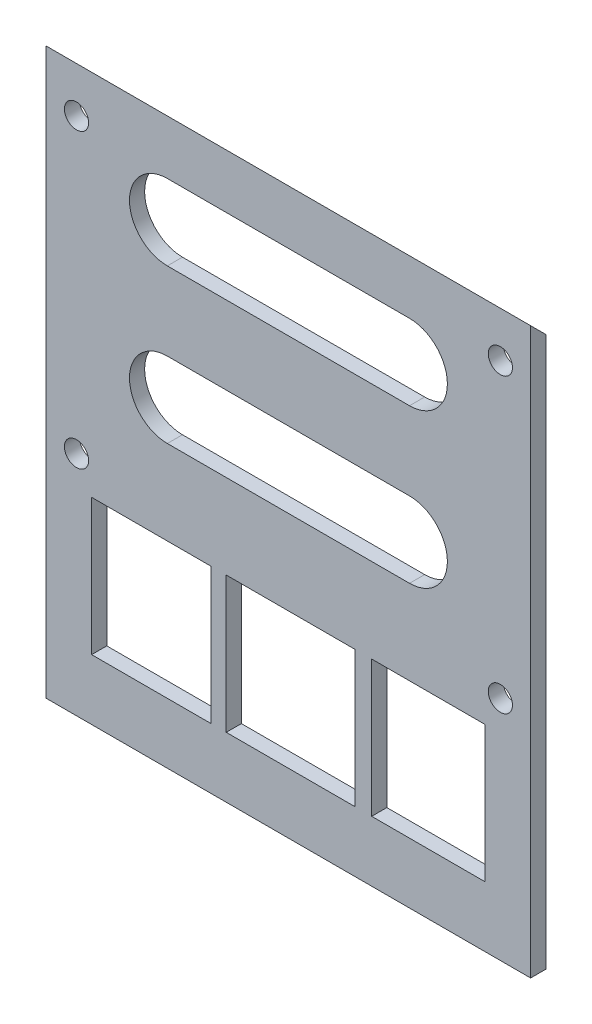
ISO-10303-21;
HEADER;
FILE_DESCRIPTION(('STEP AP214'),'2;1');
FILE_NAME('part.step','',(''),(''),'','','');
FILE_SCHEMA(('AUTOMOTIVE_DESIGN { 1 0 10303 214 1 1 1 1 }'));
ENDSEC;
DATA;
#1=APPLICATION_CONTEXT('core data for automotive mechanical design processes');
#2=APPLICATION_PROTOCOL_DEFINITION('international standard','automotive_design',2000,#1);
#3=PRODUCT_CONTEXT('',#1,'mechanical');
#4=PRODUCT('Part','Part','',(#3));
#5=PRODUCT_RELATED_PRODUCT_CATEGORY('part','',(#4));
#6=PRODUCT_DEFINITION_FORMATION('','',#4);
#7=PRODUCT_DEFINITION_CONTEXT('part definition',#1,'design');
#8=PRODUCT_DEFINITION('design','',#6,#7);
#9=PRODUCT_DEFINITION_SHAPE('','',#8);
#10=(LENGTH_UNIT() NAMED_UNIT(*) SI_UNIT(.MILLI.,.METRE.));
#11=(NAMED_UNIT(*) PLANE_ANGLE_UNIT() SI_UNIT($,.RADIAN.));
#12=(NAMED_UNIT(*) SI_UNIT($,.STERADIAN.) SOLID_ANGLE_UNIT());
#13=UNCERTAINTY_MEASURE_WITH_UNIT(LENGTH_MEASURE(1.E-05),#10,'distance_accuracy_value','');
#14=(GEOMETRIC_REPRESENTATION_CONTEXT(3) GLOBAL_UNCERTAINTY_ASSIGNED_CONTEXT((#13)) GLOBAL_UNIT_ASSIGNED_CONTEXT((#10,
#11,#12)) REPRESENTATION_CONTEXT('',''));
#15=CARTESIAN_POINT('',(0.,0.,0.));
#16=DIRECTION('',(0.,0.,1.));
#17=DIRECTION('',(1.,0.,0.));
#18=AXIS2_PLACEMENT_3D('',#15,#16,#17);
#19=CARTESIAN_POINT('',(0.,26.,2.));
#20=DIRECTION('',(0.,1.,0.));
#21=DIRECTION('',(0.,0.,1.));
#22=AXIS2_PLACEMENT_3D('',#19,#20,#21);
#23=PLANE('',#22);
#24=DIRECTION('',(0.,0.,1.));
#25=VECTOR('',#24,1.);
#26=CARTESIAN_POINT('',(23.7834334285164,26.,0.));
#27=LINE('',#26,#25);
#28=CARTESIAN_POINT('',(23.7834334285164,26.,0.));
#29=VERTEX_POINT('',#28);
#30=CARTESIAN_POINT('',(23.7834334285164,26.,2.));
#31=VERTEX_POINT('',#30);
#32=EDGE_CURVE('E311',#29,#31,#27,.T.);
#33=ORIENTED_EDGE('',*,*,#32,.F.);
#34=DIRECTION('',(1.,0.,0.));
#35=VECTOR('',#34,1.);
#36=CARTESIAN_POINT('',(0.,26.,0.));
#37=LINE('',#36,#35);
#38=CARTESIAN_POINT('',(40.7834334285164,26.,0.));
#39=VERTEX_POINT('',#38);
#40=EDGE_CURVE('E451',#29,#39,#37,.T.);
#41=ORIENTED_EDGE('',*,*,#40,.T.);
#42=DIRECTION('',(0.,0.,1.));
#43=VECTOR('',#42,1.);
#44=CARTESIAN_POINT('',(40.7834334285164,26.,0.));
#45=LINE('',#44,#43);
#46=CARTESIAN_POINT('',(40.7834334285164,26.,2.));
#47=VERTEX_POINT('',#46);
#48=EDGE_CURVE('E343',#39,#47,#45,.T.);
#49=ORIENTED_EDGE('',*,*,#48,.T.);
#50=DIRECTION('',(1.,0.,0.));
#51=VECTOR('',#50,1.);
#52=CARTESIAN_POINT('',(0.,26.,2.));
#53=LINE('',#52,#51);
#54=EDGE_CURVE('E420',#31,#47,#53,.T.);
#55=ORIENTED_EDGE('',*,*,#54,.F.);
#56=EDGE_LOOP('',(#33,#41,#49,#55));
#57=FACE_BOUND('',#56,.T.);
#58=ADVANCED_FACE('F49',(#57),#23,.F.);
#59=CARTESIAN_POINT('',(0.,8.00000000000002,2.));
#60=DIRECTION('',(0.,1.,0.));
#61=DIRECTION('',(0.,0.,1.));
#62=AXIS2_PLACEMENT_3D('',#59,#60,#61);
#63=PLANE('',#62);
#64=DIRECTION('',(1.,0.,0.));
#65=VECTOR('',#64,1.);
#66=CARTESIAN_POINT('',(0.,8.00000000000002,0.));
#67=LINE('',#66,#65);
#68=CARTESIAN_POINT('',(23.7834334285164,8.00000000000002,0.));
#69=VERTEX_POINT('',#68);
#70=CARTESIAN_POINT('',(40.7834334285164,8.00000000000002,0.));
#71=VERTEX_POINT('',#70);
#72=EDGE_CURVE('E460',#69,#71,#67,.T.);
#73=ORIENTED_EDGE('',*,*,#72,.F.);
#74=DIRECTION('',(0.,0.,1.));
#75=VECTOR('',#74,1.);
#76=CARTESIAN_POINT('',(23.7834334285164,8.00000000000002,0.));
#77=LINE('',#76,#75);
#78=CARTESIAN_POINT('',(23.7834334285164,8.00000000000002,2.));
#79=VERTEX_POINT('',#78);
#80=EDGE_CURVE('E306',#69,#79,#77,.T.);
#81=ORIENTED_EDGE('',*,*,#80,.T.);
#82=DIRECTION('',(1.,0.,0.));
#83=VECTOR('',#82,1.);
#84=CARTESIAN_POINT('',(0.,8.00000000000002,2.));
#85=LINE('',#84,#83);
#86=CARTESIAN_POINT('',(40.7834334285164,8.00000000000002,2.));
#87=VERTEX_POINT('',#86);
#88=EDGE_CURVE('E430',#79,#87,#85,.T.);
#89=ORIENTED_EDGE('',*,*,#88,.T.);
#90=DIRECTION('',(0.,0.,1.));
#91=VECTOR('',#90,1.);
#92=CARTESIAN_POINT('',(40.7834334285164,8.00000000000002,0.));
#93=LINE('',#92,#91);
#94=EDGE_CURVE('E358',#71,#87,#93,.T.);
#95=ORIENTED_EDGE('',*,*,#94,.F.);
#96=EDGE_LOOP('',(#73,#81,#89,#95));
#97=FACE_BOUND('',#96,.T.);
#98=ADVANCED_FACE('F519',(#97),#63,.T.);
#99=DIRECTION('',(0.,0.,1.));
#100=VECTOR('',#99,1.);
#101=CARTESIAN_POINT('',(43.,26.,0.));
#102=LINE('',#101,#100);
#103=CARTESIAN_POINT('',(43.,26.,0.));
#104=VERTEX_POINT('',#103);
#105=CARTESIAN_POINT('',(43.,26.,2.));
#106=VERTEX_POINT('',#105);
#107=EDGE_CURVE('E349',#104,#106,#102,.T.);
#108=ORIENTED_EDGE('',*,*,#107,.F.);
#109=CARTESIAN_POINT('',(58.0000000000001,26.,0.));
#110=VERTEX_POINT('',#109);
#111=EDGE_CURVE('E446',#104,#110,#37,.T.);
#112=ORIENTED_EDGE('',*,*,#111,.T.);
#113=DIRECTION('',(0.,0.,-1.));
#114=VECTOR('',#113,1.);
#115=CARTESIAN_POINT('',(58.0000000000001,26.,2.));
#116=LINE('',#115,#114);
#117=CARTESIAN_POINT('',(58.0000000000001,26.,2.));
#118=VERTEX_POINT('',#117);
#119=EDGE_CURVE('E475',#118,#110,#116,.T.);
#120=ORIENTED_EDGE('',*,*,#119,.F.);
#121=EDGE_CURVE('E414',#106,#118,#53,.T.);
#122=ORIENTED_EDGE('',*,*,#121,.F.);
#123=EDGE_LOOP('',(#108,#112,#120,#122));
#124=FACE_BOUND('',#123,.T.);
#125=ADVANCED_FACE('F524',(#124),#23,.F.);
#126=CARTESIAN_POINT('',(43.,8.00000000000002,0.));
#127=VERTEX_POINT('',#126);
#128=CARTESIAN_POINT('',(58.0000000000001,8.00000000000002,0.));
#129=VERTEX_POINT('',#128);
#130=EDGE_CURVE('E455',#127,#129,#67,.T.);
#131=ORIENTED_EDGE('',*,*,#130,.F.);
#132=DIRECTION('',(0.,0.,1.));
#133=VECTOR('',#132,1.);
#134=CARTESIAN_POINT('',(43.,8.00000000000002,0.));
#135=LINE('',#134,#133);
#136=CARTESIAN_POINT('',(43.,8.00000000000002,2.));
#137=VERTEX_POINT('',#136);
#138=EDGE_CURVE('E354',#127,#137,#135,.T.);
#139=ORIENTED_EDGE('',*,*,#138,.T.);
#140=CARTESIAN_POINT('',(58.0000000000001,8.00000000000002,2.));
#141=VERTEX_POINT('',#140);
#142=EDGE_CURVE('E424',#137,#141,#85,.T.);
#143=ORIENTED_EDGE('',*,*,#142,.T.);
#144=DIRECTION('',(0.,0.,-1.));
#145=VECTOR('',#144,1.);
#146=CARTESIAN_POINT('',(58.0000000000001,8.00000000000002,2.));
#147=LINE('',#146,#145);
#148=EDGE_CURVE('E471',#141,#129,#147,.T.);
#149=ORIENTED_EDGE('',*,*,#148,.T.);
#150=EDGE_LOOP('',(#131,#139,#143,#149));
#151=FACE_BOUND('',#150,.T.);
#152=ADVANCED_FACE('F520',(#151),#63,.T.);
#153=CARTESIAN_POINT('',(6.,26.,0.));
#154=VERTEX_POINT('',#153);
#155=CARTESIAN_POINT('',(21.7834334285164,26.,0.));
#156=VERTEX_POINT('',#155);
#157=EDGE_CURVE('E447',#154,#156,#37,.T.);
#158=ORIENTED_EDGE('',*,*,#157,.T.);
#159=DIRECTION('',(0.,0.,1.));
#160=VECTOR('',#159,1.);
#161=CARTESIAN_POINT('',(21.7834334285164,26.,0.));
#162=LINE('',#161,#160);
#163=CARTESIAN_POINT('',(21.7834334285164,26.,2.));
#164=VERTEX_POINT('',#163);
#165=EDGE_CURVE('E315',#156,#164,#162,.T.);
#166=ORIENTED_EDGE('',*,*,#165,.T.);
#167=CARTESIAN_POINT('',(6.,26.,2.));
#168=VERTEX_POINT('',#167);
#169=EDGE_CURVE('E415',#168,#164,#53,.T.);
#170=ORIENTED_EDGE('',*,*,#169,.F.);
#171=DIRECTION('',(0.,0.,-1.));
#172=VECTOR('',#171,1.);
#173=CARTESIAN_POINT('',(6.,26.,2.));
#174=LINE('',#173,#172);
#175=EDGE_CURVE('E464',#168,#154,#174,.T.);
#176=ORIENTED_EDGE('',*,*,#175,.T.);
#177=EDGE_LOOP('',(#158,#166,#170,#176));
#178=FACE_BOUND('',#177,.T.);
#179=ADVANCED_FACE('F525',(#178),#23,.F.);
#180=CARTESIAN_POINT('',(58.0000000000001,0.,2.));
#181=DIRECTION('',(1.,0.,0.));
#182=DIRECTION('',(0.,0.,-1.));
#183=AXIS2_PLACEMENT_3D('',#180,#181,#182);
#184=PLANE('',#183);
#185=DIRECTION('',(0.,-1.,0.));
#186=VECTOR('',#185,1.);
#187=CARTESIAN_POINT('',(58.0000000000001,0.,0.));
#188=LINE('',#187,#186);
#189=EDGE_CURVE('E450',#110,#129,#188,.T.);
#190=ORIENTED_EDGE('',*,*,#189,.T.);
#191=ORIENTED_EDGE('',*,*,#148,.F.);
#192=DIRECTION('',(0.,-1.,0.));
#193=VECTOR('',#192,1.);
#194=CARTESIAN_POINT('',(58.0000000000001,0.,2.));
#195=LINE('',#194,#193);
#196=EDGE_CURVE('E419',#118,#141,#195,.T.);
#197=ORIENTED_EDGE('',*,*,#196,.F.);
#198=ORIENTED_EDGE('',*,*,#119,.T.);
#199=EDGE_LOOP('',(#190,#191,#197,#198));
#200=FACE_BOUND('',#199,.T.);
#201=ADVANCED_FACE('F516',(#200),#184,.F.);
#202=DIRECTION('',(0.,0.,1.));
#203=VECTOR('',#202,1.);
#204=CARTESIAN_POINT('',(21.7834334285164,8.00000000000002,0.));
#205=LINE('',#204,#203);
#206=CARTESIAN_POINT('',(21.7834334285164,8.00000000000002,0.));
#207=VERTEX_POINT('',#206);
#208=CARTESIAN_POINT('',(21.7834334285164,8.00000000000002,2.));
#209=VERTEX_POINT('',#208);
#210=EDGE_CURVE('E259',#207,#209,#205,.T.);
#211=ORIENTED_EDGE('',*,*,#210,.F.);
#212=CARTESIAN_POINT('',(6.,8.00000000000002,0.));
#213=VERTEX_POINT('',#212);
#214=EDGE_CURVE('E456',#213,#207,#67,.T.);
#215=ORIENTED_EDGE('',*,*,#214,.F.);
#216=DIRECTION('',(0.,0.,-1.));
#217=VECTOR('',#216,1.);
#218=CARTESIAN_POINT('',(6.,8.00000000000002,2.));
#219=LINE('',#218,#217);
#220=CARTESIAN_POINT('',(6.,8.00000000000002,2.));
#221=VERTEX_POINT('',#220);
#222=EDGE_CURVE('E467',#221,#213,#219,.T.);
#223=ORIENTED_EDGE('',*,*,#222,.F.);
#224=EDGE_CURVE('E425',#221,#209,#85,.T.);
#225=ORIENTED_EDGE('',*,*,#224,.T.);
#226=EDGE_LOOP('',(#211,#215,#223,#225));
#227=FACE_BOUND('',#226,.T.);
#228=ADVANCED_FACE('F508',(#227),#63,.T.);
#229=CARTESIAN_POINT('',(0.,0.,2.));
#230=DIRECTION('',(0.,1.,0.));
#231=DIRECTION('',(0.,0.,1.));
#232=AXIS2_PLACEMENT_3D('',#229,#230,#231);
#233=PLANE('',#232);
#234=DIRECTION('',(1.,0.,0.));
#235=VECTOR('',#234,1.);
#236=CARTESIAN_POINT('',(0.,0.,0.));
#237=LINE('',#236,#235);
#238=CARTESIAN_POINT('',(0.,0.,0.));
#239=VERTEX_POINT('',#238);
#240=CARTESIAN_POINT('',(64.,0.,0.));
#241=VERTEX_POINT('',#240);
#242=EDGE_CURVE('E393',#239,#241,#237,.T.);
#243=ORIENTED_EDGE('',*,*,#242,.T.);
#244=DIRECTION('',(0.,0.,-1.));
#245=VECTOR('',#244,1.);
#246=CARTESIAN_POINT('',(64.,0.,2.));
#247=LINE('',#246,#245);
#248=CARTESIAN_POINT('',(64.,0.,2.));
#249=VERTEX_POINT('',#248);
#250=EDGE_CURVE('E468',#249,#241,#247,.T.);
#251=ORIENTED_EDGE('',*,*,#250,.F.);
#252=DIRECTION('',(1.,0.,0.));
#253=VECTOR('',#252,1.);
#254=CARTESIAN_POINT('',(0.,0.,2.));
#255=LINE('',#254,#253);
#256=CARTESIAN_POINT('',(0.,0.,2.));
#257=VERTEX_POINT('',#256);
#258=EDGE_CURVE('E397',#257,#249,#255,.T.);
#259=ORIENTED_EDGE('',*,*,#258,.F.);
#260=DIRECTION('',(0.,0.,-1.));
#261=VECTOR('',#260,1.);
#262=CARTESIAN_POINT('',(0.,0.,2.));
#263=LINE('',#262,#261);
#264=EDGE_CURVE('E434',#257,#239,#263,.T.);
#265=ORIENTED_EDGE('',*,*,#264,.T.);
#266=EDGE_LOOP('',(#243,#251,#259,#265));
#267=FACE_BOUND('',#266,.T.);
#268=ADVANCED_FACE('F506',(#267),#233,.F.);
#269=CARTESIAN_POINT('',(64.,0.,2.));
#270=DIRECTION('',(-1.,0.,0.));
#271=DIRECTION('',(0.,0.,1.));
#272=AXIS2_PLACEMENT_3D('',#269,#270,#271);
#273=PLANE('',#272);
#274=DIRECTION('',(0.,1.,0.));
#275=VECTOR('',#274,1.);
#276=CARTESIAN_POINT('',(64.,0.,0.));
#277=LINE('',#276,#275);
#278=CARTESIAN_POINT('',(64.,72.64,0.));
#279=VERTEX_POINT('',#278);
#280=EDGE_CURVE('E438',#241,#279,#277,.T.);
#281=ORIENTED_EDGE('',*,*,#280,.T.);
#282=DIRECTION('',(0.,-0.70710678118655,-0.707106781186545));
#283=VECTOR('',#282,1.);
#284=CARTESIAN_POINT('',(64.,74.64,1.99999999999999));
#285=LINE('',#284,#283);
#286=CARTESIAN_POINT('',(64.,74.64,2.));
#287=VERTEX_POINT('',#286);
#288=EDGE_CURVE('E11',#279,#287,#285,.F.);
#289=ORIENTED_EDGE('',*,*,#288,.T.);
#290=DIRECTION('',(0.,1.,0.));
#291=VECTOR('',#290,1.);
#292=CARTESIAN_POINT('',(64.,0.,2.));
#293=LINE('',#292,#291);
#294=EDGE_CURVE('E401',#249,#287,#293,.T.);
#295=ORIENTED_EDGE('',*,*,#294,.F.);
#296=ORIENTED_EDGE('',*,*,#250,.T.);
#297=EDGE_LOOP('',(#281,#289,#295,#296));
#298=FACE_BOUND('',#297,.T.);
#299=ADVANCED_FACE('F496',(#298),#273,.F.);
#300=CARTESIAN_POINT('',(0.,0.,2.));
#301=DIRECTION('',(-1.,0.,0.));
#302=DIRECTION('',(0.,-1.,0.));
#303=AXIS2_PLACEMENT_3D('',#300,#301,#302);
#304=PLANE('',#303);
#305=DIRECTION('',(0.,1.,0.));
#306=VECTOR('',#305,1.);
#307=CARTESIAN_POINT('',(0.,0.,2.));
#308=LINE('',#307,#306);
#309=CARTESIAN_POINT('',(0.,74.64,2.));
#310=VERTEX_POINT('',#309);
#311=EDGE_CURVE('E410',#257,#310,#308,.T.);
#312=ORIENTED_EDGE('',*,*,#311,.T.);
#313=DIRECTION('',(0.,0.70710678118655,0.707106781186545));
#314=VECTOR('',#313,1.);
#315=CARTESIAN_POINT('',(0.,37.3199999999997,-35.32));
#316=LINE('',#315,#314);
#317=CARTESIAN_POINT('',(0.,72.64,0.));
#318=VERTEX_POINT('',#317);
#319=EDGE_CURVE('E479',#310,#318,#316,.F.);
#320=ORIENTED_EDGE('',*,*,#319,.T.);
#321=DIRECTION('',(0.,1.,0.));
#322=VECTOR('',#321,1.);
#323=CARTESIAN_POINT('',(0.,0.,0.));
#324=LINE('',#323,#322);
#325=EDGE_CURVE('E442',#239,#318,#324,.T.);
#326=ORIENTED_EDGE('',*,*,#325,.F.);
#327=ORIENTED_EDGE('',*,*,#264,.F.);
#328=EDGE_LOOP('',(#312,#320,#326,#327));
#329=FACE_BOUND('',#328,.T.);
#330=ADVANCED_FACE('F503',(#329),#304,.T.);
#331=CARTESIAN_POINT('',(6.,0.,2.));
#332=DIRECTION('',(1.,0.,0.));
#333=DIRECTION('',(0.,1.,0.));
#334=AXIS2_PLACEMENT_3D('',#331,#332,#333);
#335=PLANE('',#334);
#336=DIRECTION('',(0.,-1.,0.));
#337=VECTOR('',#336,1.);
#338=CARTESIAN_POINT('',(6.,0.,0.));
#339=LINE('',#338,#337);
#340=EDGE_CURVE('E402',#154,#213,#339,.T.);
#341=ORIENTED_EDGE('',*,*,#340,.F.);
#342=ORIENTED_EDGE('',*,*,#175,.F.);
#343=DIRECTION('',(0.,-1.,0.));
#344=VECTOR('',#343,1.);
#345=CARTESIAN_POINT('',(6.,0.,2.));
#346=LINE('',#345,#344);
#347=EDGE_CURVE('E429',#168,#221,#346,.T.);
#348=ORIENTED_EDGE('',*,*,#347,.T.);
#349=ORIENTED_EDGE('',*,*,#222,.T.);
#350=EDGE_LOOP('',(#341,#342,#348,#349));
#351=FACE_BOUND('',#350,.T.);
#352=ADVANCED_FACE('F556',(#351),#335,.T.);
#353=CARTESIAN_POINT('',(0.,0.,2.));
#354=DIRECTION('',(0.,0.,1.));
#355=DIRECTION('',(1.,0.,0.));
#356=AXIS2_PLACEMENT_3D('',#353,#354,#355);
#357=PLANE('',#356);
#358=CARTESIAN_POINT('',(48.,42.1600000000005,2.));
#359=DIRECTION('',(0.,0.,-1.));
#360=DIRECTION('',(-1.,0.,0.));
#361=AXIS2_PLACEMENT_3D('',#358,#359,#360);
#362=CIRCLE('',#361,5.);
#363=CARTESIAN_POINT('',(48.,47.16,2.));
#364=VERTEX_POINT('',#363);
#365=CARTESIAN_POINT('',(48.,37.16,2.));
#366=VERTEX_POINT('',#365);
#367=EDGE_CURVE('E215',#364,#366,#362,.T.);
#368=ORIENTED_EDGE('',*,*,#367,.T.);
#369=DIRECTION('',(-1.,0.,0.));
#370=VECTOR('',#369,1.);
#371=CARTESIAN_POINT('',(48.,37.16,2.));
#372=LINE('',#371,#370);
#373=CARTESIAN_POINT('',(16.,37.16,2.));
#374=VERTEX_POINT('',#373);
#375=EDGE_CURVE('E227',#366,#374,#372,.T.);
#376=ORIENTED_EDGE('',*,*,#375,.T.);
#377=CARTESIAN_POINT('',(16.,42.16,2.));
#378=DIRECTION('',(0.,0.,-1.));
#379=DIRECTION('',(-1.,0.,0.));
#380=AXIS2_PLACEMENT_3D('',#377,#378,#379);
#381=CIRCLE('',#380,5.);
#382=CARTESIAN_POINT('',(16.,47.16,2.));
#383=VERTEX_POINT('',#382);
#384=EDGE_CURVE('E66',#374,#383,#381,.T.);
#385=ORIENTED_EDGE('',*,*,#384,.T.);
#386=DIRECTION('',(1.,0.,0.));
#387=VECTOR('',#386,1.);
#388=CARTESIAN_POINT('',(48.,47.16,2.));
#389=LINE('',#388,#387);
#390=EDGE_CURVE('E224',#383,#364,#389,.T.);
#391=ORIENTED_EDGE('',*,*,#390,.T.);
#392=EDGE_LOOP('',(#368,#376,#385,#391));
#393=FACE_BOUND('',#392,.T.);
#394=CARTESIAN_POINT('',(48.,62.48,2.));
#395=DIRECTION('',(0.,0.,-1.));
#396=DIRECTION('',(-1.,0.,0.));
#397=AXIS2_PLACEMENT_3D('',#394,#395,#396);
#398=CIRCLE('',#397,5.);
#399=CARTESIAN_POINT('',(48.,67.48,2.));
#400=VERTEX_POINT('',#399);
#401=CARTESIAN_POINT('',(48.,57.48,2.));
#402=VERTEX_POINT('',#401);
#403=EDGE_CURVE('E284',#400,#402,#398,.T.);
#404=ORIENTED_EDGE('',*,*,#403,.T.);
#405=DIRECTION('',(-1.,0.,0.));
#406=VECTOR('',#405,1.);
#407=CARTESIAN_POINT('',(48.,57.48,2.));
#408=LINE('',#407,#406);
#409=CARTESIAN_POINT('',(16.,57.48,2.));
#410=VERTEX_POINT('',#409);
#411=EDGE_CURVE('E299',#402,#410,#408,.T.);
#412=ORIENTED_EDGE('',*,*,#411,.T.);
#413=CARTESIAN_POINT('',(16.,62.48,2.));
#414=DIRECTION('',(0.,0.,-1.));
#415=DIRECTION('',(-1.,0.,0.));
#416=AXIS2_PLACEMENT_3D('',#413,#414,#415);
#417=CIRCLE('',#416,5.);
#418=CARTESIAN_POINT('',(16.,67.48,2.));
#419=VERTEX_POINT('',#418);
#420=EDGE_CURVE('E74',#410,#419,#417,.T.);
#421=ORIENTED_EDGE('',*,*,#420,.T.);
#422=DIRECTION('',(1.,0.,0.));
#423=VECTOR('',#422,1.);
#424=CARTESIAN_POINT('',(48.,67.48,2.));
#425=LINE('',#424,#423);
#426=EDGE_CURVE('E269',#419,#400,#425,.T.);
#427=ORIENTED_EDGE('',*,*,#426,.T.);
#428=EDGE_LOOP('',(#404,#412,#421,#427));
#429=FACE_BOUND('',#428,.T.);
#430=ORIENTED_EDGE('',*,*,#88,.F.);
#431=DIRECTION('',(0.,-1.,0.));
#432=VECTOR('',#431,1.);
#433=CARTESIAN_POINT('',(23.7834334285164,26.,2.));
#434=LINE('',#433,#432);
#435=EDGE_CURVE('E324',#31,#79,#434,.T.);
#436=ORIENTED_EDGE('',*,*,#435,.F.);
#437=ORIENTED_EDGE('',*,*,#54,.T.);
#438=DIRECTION('',(0.,-1.,0.));
#439=VECTOR('',#438,1.);
#440=CARTESIAN_POINT('',(40.7834334285164,0.,2.));
#441=LINE('',#440,#439);
#442=EDGE_CURVE('E328',#47,#87,#441,.T.);
#443=ORIENTED_EDGE('',*,*,#442,.T.);
#444=EDGE_LOOP('',(#430,#436,#437,#443));
#445=FACE_BOUND('',#444,.T.);
#446=DIRECTION('',(0.,-1.,0.));
#447=VECTOR('',#446,1.);
#448=CARTESIAN_POINT('',(43.,0.,2.));
#449=LINE('',#448,#447);
#450=EDGE_CURVE('E339',#106,#137,#449,.T.);
#451=ORIENTED_EDGE('',*,*,#450,.F.);
#452=ORIENTED_EDGE('',*,*,#121,.T.);
#453=ORIENTED_EDGE('',*,*,#196,.T.);
#454=ORIENTED_EDGE('',*,*,#142,.F.);
#455=EDGE_LOOP('',(#451,#452,#453,#454));
#456=FACE_BOUND('',#455,.T.);
#457=CARTESIAN_POINT('',(60.,30.,2.));
#458=DIRECTION('',(0.,0.,1.));
#459=DIRECTION('',(1.,0.,0.));
#460=AXIS2_PLACEMENT_3D('',#457,#458,#459);
#461=CIRCLE('',#460,1.6);
#462=CARTESIAN_POINT('',(61.6,30.,2.));
#463=VERTEX_POINT('',#462);
#464=EDGE_CURVE('E373',#463,#463,#461,.T.);
#465=ORIENTED_EDGE('',*,*,#464,.F.);
#466=EDGE_LOOP('',(#465));
#467=FACE_BOUND('',#466,.T.);
#468=CARTESIAN_POINT('',(4.,68.64,2.));
#469=DIRECTION('',(0.,0.,1.));
#470=DIRECTION('',(1.,0.,0.));
#471=AXIS2_PLACEMENT_3D('',#468,#469,#470);
#472=CIRCLE('',#471,1.6);
#473=CARTESIAN_POINT('',(5.6,68.64,2.));
#474=VERTEX_POINT('',#473);
#475=EDGE_CURVE('E382',#474,#474,#472,.T.);
#476=ORIENTED_EDGE('',*,*,#475,.F.);
#477=EDGE_LOOP('',(#476));
#478=FACE_BOUND('',#477,.T.);
#479=CARTESIAN_POINT('',(60.,68.64,2.));
#480=DIRECTION('',(0.,0.,1.));
#481=DIRECTION('',(1.,0.,0.));
#482=AXIS2_PLACEMENT_3D('',#479,#480,#481);
#483=CIRCLE('',#482,1.6);
#484=CARTESIAN_POINT('',(61.6,68.64,2.));
#485=VERTEX_POINT('',#484);
#486=EDGE_CURVE('E365',#485,#485,#483,.T.);
#487=ORIENTED_EDGE('',*,*,#486,.F.);
#488=EDGE_LOOP('',(#487));
#489=FACE_BOUND('',#488,.T.);
#490=CARTESIAN_POINT('',(4.,30.,2.));
#491=DIRECTION('',(0.,0.,1.));
#492=DIRECTION('',(1.,0.,0.));
#493=AXIS2_PLACEMENT_3D('',#490,#491,#492);
#494=CIRCLE('',#493,1.6);
#495=CARTESIAN_POINT('',(5.6,30.,2.));
#496=VERTEX_POINT('',#495);
#497=EDGE_CURVE('E377',#496,#496,#494,.T.);
#498=ORIENTED_EDGE('',*,*,#497,.F.);
#499=EDGE_LOOP('',(#498));
#500=FACE_BOUND('',#499,.T.);
#501=ORIENTED_EDGE('',*,*,#258,.T.);
#502=ORIENTED_EDGE('',*,*,#294,.T.);
#503=DIRECTION('',(-1.,0.,0.));
#504=VECTOR('',#503,1.);
#505=CARTESIAN_POINT('',(0.,74.64,2.));
#506=LINE('',#505,#504);
#507=EDGE_CURVE('E406',#287,#310,#506,.T.);
#508=ORIENTED_EDGE('',*,*,#507,.T.);
#509=ORIENTED_EDGE('',*,*,#311,.F.);
#510=EDGE_LOOP('',(#501,#502,#508,#509));
#511=FACE_BOUND('',#510,.T.);
#512=ORIENTED_EDGE('',*,*,#169,.T.);
#513=DIRECTION('',(0.,-1.,0.));
#514=VECTOR('',#513,1.);
#515=CARTESIAN_POINT('',(21.7834334285164,26.,2.));
#516=LINE('',#515,#514);
#517=EDGE_CURVE('E320',#164,#209,#516,.T.);
#518=ORIENTED_EDGE('',*,*,#517,.T.);
#519=ORIENTED_EDGE('',*,*,#224,.F.);
#520=ORIENTED_EDGE('',*,*,#347,.F.);
#521=EDGE_LOOP('',(#512,#518,#519,#520));
#522=FACE_BOUND('',#521,.T.);
#523=ADVANCED_FACE('F232',(#393,#429,#445,#456,#467,#478,#489,#500,#511,#522),#357,.T.);
#524=CARTESIAN_POINT('',(0.,0.,0.));
#525=DIRECTION('',(0.,0.,1.));
#526=DIRECTION('',(1.,0.,0.));
#527=AXIS2_PLACEMENT_3D('',#524,#525,#526);
#528=PLANE('',#527);
#529=DIRECTION('',(-1.,0.,0.));
#530=VECTOR('',#529,1.);
#531=CARTESIAN_POINT('',(48.,37.16,0.));
#532=LINE('',#531,#530);
#533=CARTESIAN_POINT('',(48.,37.16,0.));
#534=VERTEX_POINT('',#533);
#535=CARTESIAN_POINT('',(16.,37.16,0.));
#536=VERTEX_POINT('',#535);
#537=EDGE_CURVE('E249',#534,#536,#532,.T.);
#538=ORIENTED_EDGE('',*,*,#537,.F.);
#539=CARTESIAN_POINT('',(48.,42.1600000000005,0.));
#540=DIRECTION('',(0.,0.,-1.));
#541=DIRECTION('',(-1.,0.,0.));
#542=AXIS2_PLACEMENT_3D('',#539,#540,#541);
#543=CIRCLE('',#542,5.);
#544=CARTESIAN_POINT('',(48.,47.16,0.));
#545=VERTEX_POINT('',#544);
#546=EDGE_CURVE('E218',#545,#534,#543,.T.);
#547=ORIENTED_EDGE('',*,*,#546,.F.);
#548=DIRECTION('',(1.,0.,0.));
#549=VECTOR('',#548,1.);
#550=CARTESIAN_POINT('',(48.,47.16,0.));
#551=LINE('',#550,#549);
#552=CARTESIAN_POINT('',(16.,47.16,0.));
#553=VERTEX_POINT('',#552);
#554=EDGE_CURVE('E236',#553,#545,#551,.T.);
#555=ORIENTED_EDGE('',*,*,#554,.F.);
#556=CARTESIAN_POINT('',(16.,42.16,0.));
#557=DIRECTION('',(0.,0.,-1.));
#558=DIRECTION('',(-1.,0.,0.));
#559=AXIS2_PLACEMENT_3D('',#556,#557,#558);
#560=CIRCLE('',#559,5.);
#561=EDGE_CURVE('E240',#536,#553,#560,.T.);
#562=ORIENTED_EDGE('',*,*,#561,.F.);
#563=EDGE_LOOP('',(#538,#547,#555,#562));
#564=FACE_BOUND('',#563,.T.);
#565=DIRECTION('',(-1.,0.,0.));
#566=VECTOR('',#565,1.);
#567=CARTESIAN_POINT('',(48.,57.48,0.));
#568=LINE('',#567,#566);
#569=CARTESIAN_POINT('',(48.,57.48,0.));
#570=VERTEX_POINT('',#569);
#571=CARTESIAN_POINT('',(16.,57.48,0.));
#572=VERTEX_POINT('',#571);
#573=EDGE_CURVE('E288',#570,#572,#568,.T.);
#574=ORIENTED_EDGE('',*,*,#573,.F.);
#575=CARTESIAN_POINT('',(48.,62.48,0.));
#576=DIRECTION('',(0.,0.,-1.));
#577=DIRECTION('',(-1.,0.,0.));
#578=AXIS2_PLACEMENT_3D('',#575,#576,#577);
#579=CIRCLE('',#578,5.);
#580=CARTESIAN_POINT('',(48.,67.48,0.));
#581=VERTEX_POINT('',#580);
#582=EDGE_CURVE('E250',#581,#570,#579,.T.);
#583=ORIENTED_EDGE('',*,*,#582,.F.);
#584=DIRECTION('',(1.,0.,0.));
#585=VECTOR('',#584,1.);
#586=CARTESIAN_POINT('',(48.,67.48,0.));
#587=LINE('',#586,#585);
#588=CARTESIAN_POINT('',(16.,67.48,0.));
#589=VERTEX_POINT('',#588);
#590=EDGE_CURVE('E279',#589,#581,#587,.T.);
#591=ORIENTED_EDGE('',*,*,#590,.F.);
#592=CARTESIAN_POINT('',(16.,62.48,0.));
#593=DIRECTION('',(0.,0.,-1.));
#594=DIRECTION('',(-1.,0.,0.));
#595=AXIS2_PLACEMENT_3D('',#592,#593,#594);
#596=CIRCLE('',#595,5.);
#597=EDGE_CURVE('E283',#572,#589,#596,.T.);
#598=ORIENTED_EDGE('',*,*,#597,.F.);
#599=EDGE_LOOP('',(#574,#583,#591,#598));
#600=FACE_BOUND('',#599,.T.);
#601=DIRECTION('',(0.,-1.,0.));
#602=VECTOR('',#601,1.);
#603=CARTESIAN_POINT('',(23.7834334285164,26.,0.));
#604=LINE('',#603,#602);
#605=EDGE_CURVE('E325',#29,#69,#604,.T.);
#606=ORIENTED_EDGE('',*,*,#605,.T.);
#607=ORIENTED_EDGE('',*,*,#72,.T.);
#608=DIRECTION('',(0.,-1.,0.));
#609=VECTOR('',#608,1.);
#610=CARTESIAN_POINT('',(40.7834334285164,0.,0.));
#611=LINE('',#610,#609);
#612=EDGE_CURVE('E334',#39,#71,#611,.T.);
#613=ORIENTED_EDGE('',*,*,#612,.F.);
#614=ORIENTED_EDGE('',*,*,#40,.F.);
#615=EDGE_LOOP('',(#606,#607,#613,#614));
#616=FACE_BOUND('',#615,.T.);
#617=ORIENTED_EDGE('',*,*,#111,.F.);
#618=DIRECTION('',(0.,-1.,0.));
#619=VECTOR('',#618,1.);
#620=CARTESIAN_POINT('',(43.,0.,0.));
#621=LINE('',#620,#619);
#622=EDGE_CURVE('E338',#104,#127,#621,.T.);
#623=ORIENTED_EDGE('',*,*,#622,.T.);
#624=ORIENTED_EDGE('',*,*,#130,.T.);
#625=ORIENTED_EDGE('',*,*,#189,.F.);
#626=EDGE_LOOP('',(#617,#623,#624,#625));
#627=FACE_BOUND('',#626,.T.);
#628=CARTESIAN_POINT('',(60.,30.,0.));
#629=DIRECTION('',(0.,0.,1.));
#630=DIRECTION('',(1.,0.,0.));
#631=AXIS2_PLACEMENT_3D('',#628,#629,#630);
#632=CIRCLE('',#631,1.6);
#633=CARTESIAN_POINT('',(61.6,30.,0.));
#634=VERTEX_POINT('',#633);
#635=EDGE_CURVE('E378',#634,#634,#632,.T.);
#636=ORIENTED_EDGE('',*,*,#635,.T.);
#637=EDGE_LOOP('',(#636));
#638=FACE_BOUND('',#637,.T.);
#639=CARTESIAN_POINT('',(4.,68.64,0.));
#640=DIRECTION('',(0.,0.,1.));
#641=DIRECTION('',(1.,0.,0.));
#642=AXIS2_PLACEMENT_3D('',#639,#640,#641);
#643=CIRCLE('',#642,1.6);
#644=CARTESIAN_POINT('',(5.6,68.64,0.));
#645=VERTEX_POINT('',#644);
#646=EDGE_CURVE('E369',#645,#645,#643,.T.);
#647=ORIENTED_EDGE('',*,*,#646,.T.);
#648=EDGE_LOOP('',(#647));
#649=FACE_BOUND('',#648,.T.);
#650=CARTESIAN_POINT('',(60.,68.64,0.));
#651=DIRECTION('',(0.,0.,1.));
#652=DIRECTION('',(1.,0.,0.));
#653=AXIS2_PLACEMENT_3D('',#650,#651,#652);
#654=CIRCLE('',#653,1.6);
#655=CARTESIAN_POINT('',(61.6,68.64,0.));
#656=VERTEX_POINT('',#655);
#657=EDGE_CURVE('E353',#656,#656,#654,.T.);
#658=ORIENTED_EDGE('',*,*,#657,.T.);
#659=EDGE_LOOP('',(#658));
#660=FACE_BOUND('',#659,.T.);
#661=CARTESIAN_POINT('',(4.,30.,0.));
#662=DIRECTION('',(0.,0.,1.));
#663=DIRECTION('',(1.,0.,0.));
#664=AXIS2_PLACEMENT_3D('',#661,#662,#663);
#665=CIRCLE('',#664,1.6);
#666=CARTESIAN_POINT('',(5.6,30.,0.));
#667=VERTEX_POINT('',#666);
#668=EDGE_CURVE('E389',#667,#667,#665,.T.);
#669=ORIENTED_EDGE('',*,*,#668,.T.);
#670=EDGE_LOOP('',(#669));
#671=FACE_BOUND('',#670,.T.);
#672=ORIENTED_EDGE('',*,*,#325,.T.);
#673=DIRECTION('',(1.,0.,0.));
#674=VECTOR('',#673,1.);
#675=CARTESIAN_POINT('',(0.,72.64,0.));
#676=LINE('',#675,#674);
#677=EDGE_CURVE('E59',#318,#279,#676,.T.);
#678=ORIENTED_EDGE('',*,*,#677,.T.);
#679=ORIENTED_EDGE('',*,*,#280,.F.);
#680=ORIENTED_EDGE('',*,*,#242,.F.);
#681=EDGE_LOOP('',(#672,#678,#679,#680));
#682=FACE_BOUND('',#681,.T.);
#683=ORIENTED_EDGE('',*,*,#157,.F.);
#684=ORIENTED_EDGE('',*,*,#340,.T.);
#685=ORIENTED_EDGE('',*,*,#214,.T.);
#686=DIRECTION('',(0.,-1.,0.));
#687=VECTOR('',#686,1.);
#688=CARTESIAN_POINT('',(21.7834334285164,26.,0.));
#689=LINE('',#688,#687);
#690=EDGE_CURVE('E310',#156,#207,#689,.T.);
#691=ORIENTED_EDGE('',*,*,#690,.F.);
#692=EDGE_LOOP('',(#683,#684,#685,#691));
#693=FACE_BOUND('',#692,.T.);
#694=ADVANCED_FACE('F489',(#564,#600,#616,#627,#638,#649,#660,#671,#682,#693),#528,.F.);
#695=CARTESIAN_POINT('',(0.,74.64,2.));
#696=DIRECTION('',(0.,-0.707106781186545,0.70710678118655));
#697=DIRECTION('',(-1.,0.,0.));
#698=AXIS2_PLACEMENT_3D('',#695,#696,#697);
#699=PLANE('',#698);
#700=ORIENTED_EDGE('',*,*,#288,.F.);
#701=ORIENTED_EDGE('',*,*,#677,.F.);
#702=ORIENTED_EDGE('',*,*,#319,.F.);
#703=ORIENTED_EDGE('',*,*,#507,.F.);
#704=EDGE_LOOP('',(#700,#701,#702,#703));
#705=FACE_BOUND('',#704,.T.);
#706=ADVANCED_FACE('F52',(#705),#699,.F.);
#707=CARTESIAN_POINT('',(4.,30.,0.));
#708=DIRECTION('',(0.,0.,1.));
#709=DIRECTION('',(1.,0.,0.));
#710=AXIS2_PLACEMENT_3D('',#707,#708,#709);
#711=CYLINDRICAL_SURFACE('',#710,1.6);
#712=ORIENTED_EDGE('',*,*,#668,.F.);
#713=EDGE_LOOP('',(#712));
#714=FACE_BOUND('',#713,.T.);
#715=ORIENTED_EDGE('',*,*,#497,.T.);
#716=EDGE_LOOP('',(#715));
#717=FACE_BOUND('',#716,.T.);
#718=ADVANCED_FACE('F567',(#714,#717),#711,.F.);
#719=CARTESIAN_POINT('',(60.,68.64,0.));
#720=DIRECTION('',(0.,0.,1.));
#721=DIRECTION('',(1.,0.,0.));
#722=AXIS2_PLACEMENT_3D('',#719,#720,#721);
#723=CYLINDRICAL_SURFACE('',#722,1.6);
#724=ORIENTED_EDGE('',*,*,#657,.F.);
#725=EDGE_LOOP('',(#724));
#726=FACE_BOUND('',#725,.T.);
#727=ORIENTED_EDGE('',*,*,#486,.T.);
#728=EDGE_LOOP('',(#727));
#729=FACE_BOUND('',#728,.T.);
#730=ADVANCED_FACE('F570',(#726,#729),#723,.F.);
#731=CARTESIAN_POINT('',(4.,68.64,0.));
#732=DIRECTION('',(0.,0.,1.));
#733=DIRECTION('',(1.,0.,0.));
#734=AXIS2_PLACEMENT_3D('',#731,#732,#733);
#735=CYLINDRICAL_SURFACE('',#734,1.6);
#736=ORIENTED_EDGE('',*,*,#646,.F.);
#737=EDGE_LOOP('',(#736));
#738=FACE_BOUND('',#737,.T.);
#739=ORIENTED_EDGE('',*,*,#475,.T.);
#740=EDGE_LOOP('',(#739));
#741=FACE_BOUND('',#740,.T.);
#742=ADVANCED_FACE('F572',(#738,#741),#735,.F.);
#743=CARTESIAN_POINT('',(60.,30.,0.));
#744=DIRECTION('',(0.,0.,1.));
#745=DIRECTION('',(1.,0.,0.));
#746=AXIS2_PLACEMENT_3D('',#743,#744,#745);
#747=CYLINDRICAL_SURFACE('',#746,1.6);
#748=ORIENTED_EDGE('',*,*,#635,.F.);
#749=EDGE_LOOP('',(#748));
#750=FACE_BOUND('',#749,.T.);
#751=ORIENTED_EDGE('',*,*,#464,.T.);
#752=EDGE_LOOP('',(#751));
#753=FACE_BOUND('',#752,.T.);
#754=ADVANCED_FACE('F575',(#750,#753),#747,.F.);
#755=CARTESIAN_POINT('',(43.,0.,0.));
#756=DIRECTION('',(-1.,0.,0.));
#757=DIRECTION('',(0.,0.,1.));
#758=AXIS2_PLACEMENT_3D('',#755,#756,#757);
#759=PLANE('',#758);
#760=ORIENTED_EDGE('',*,*,#450,.T.);
#761=ORIENTED_EDGE('',*,*,#138,.F.);
#762=ORIENTED_EDGE('',*,*,#622,.F.);
#763=ORIENTED_EDGE('',*,*,#107,.T.);
#764=EDGE_LOOP('',(#760,#761,#762,#763));
#765=FACE_BOUND('',#764,.T.);
#766=ADVANCED_FACE('F578',(#765),#759,.F.);
#767=CARTESIAN_POINT('',(40.7834334285164,0.,0.));
#768=DIRECTION('',(-1.,0.,0.));
#769=DIRECTION('',(0.,0.,1.));
#770=AXIS2_PLACEMENT_3D('',#767,#768,#769);
#771=PLANE('',#770);
#772=ORIENTED_EDGE('',*,*,#442,.F.);
#773=ORIENTED_EDGE('',*,*,#48,.F.);
#774=ORIENTED_EDGE('',*,*,#612,.T.);
#775=ORIENTED_EDGE('',*,*,#94,.T.);
#776=EDGE_LOOP('',(#772,#773,#774,#775));
#777=FACE_BOUND('',#776,.T.);
#778=ADVANCED_FACE('F583',(#777),#771,.T.);
#779=CARTESIAN_POINT('',(21.7834334285164,26.,0.));
#780=DIRECTION('',(-1.,0.,0.));
#781=DIRECTION('',(0.,-1.,0.));
#782=AXIS2_PLACEMENT_3D('',#779,#780,#781);
#783=PLANE('',#782);
#784=ORIENTED_EDGE('',*,*,#517,.F.);
#785=ORIENTED_EDGE('',*,*,#165,.F.);
#786=ORIENTED_EDGE('',*,*,#690,.T.);
#787=ORIENTED_EDGE('',*,*,#210,.T.);
#788=EDGE_LOOP('',(#784,#785,#786,#787));
#789=FACE_BOUND('',#788,.T.);
#790=ADVANCED_FACE('F550',(#789),#783,.T.);
#791=CARTESIAN_POINT('',(23.7834334285164,26.,0.));
#792=DIRECTION('',(-1.,0.,0.));
#793=DIRECTION('',(0.,-1.,0.));
#794=AXIS2_PLACEMENT_3D('',#791,#792,#793);
#795=PLANE('',#794);
#796=ORIENTED_EDGE('',*,*,#435,.T.);
#797=ORIENTED_EDGE('',*,*,#80,.F.);
#798=ORIENTED_EDGE('',*,*,#605,.F.);
#799=ORIENTED_EDGE('',*,*,#32,.T.);
#800=EDGE_LOOP('',(#796,#797,#798,#799));
#801=FACE_BOUND('',#800,.T.);
#802=ADVANCED_FACE('F592',(#801),#795,.F.);
#803=CARTESIAN_POINT('',(48.,62.48,2.));
#804=DIRECTION('',(0.,0.,-1.));
#805=DIRECTION('',(-1.,0.,0.));
#806=AXIS2_PLACEMENT_3D('',#803,#804,#805);
#807=CYLINDRICAL_SURFACE('',#806,5.);
#808=ORIENTED_EDGE('',*,*,#582,.T.);
#809=DIRECTION('',(0.,0.,-1.));
#810=VECTOR('',#809,1.);
#811=CARTESIAN_POINT('',(48.,57.48,2.));
#812=LINE('',#811,#810);
#813=EDGE_CURVE('E265',#402,#570,#812,.T.);
#814=ORIENTED_EDGE('',*,*,#813,.F.);
#815=ORIENTED_EDGE('',*,*,#403,.F.);
#816=DIRECTION('',(0.,0.,-1.));
#817=VECTOR('',#816,1.);
#818=CARTESIAN_POINT('',(48.,67.48,2.));
#819=LINE('',#818,#817);
#820=EDGE_CURVE('E276',#400,#581,#819,.T.);
#821=ORIENTED_EDGE('',*,*,#820,.T.);
#822=EDGE_LOOP('',(#808,#814,#815,#821));
#823=FACE_BOUND('',#822,.T.);
#824=ADVANCED_FACE('F595',(#823),#807,.F.);
#825=CARTESIAN_POINT('',(48.,67.48,2.));
#826=DIRECTION('',(0.,1.,0.));
#827=DIRECTION('',(0.,0.,1.));
#828=AXIS2_PLACEMENT_3D('',#825,#826,#827);
#829=PLANE('',#828);
#830=ORIENTED_EDGE('',*,*,#590,.T.);
#831=ORIENTED_EDGE('',*,*,#820,.F.);
#832=ORIENTED_EDGE('',*,*,#426,.F.);
#833=DIRECTION('',(0.,0.,-1.));
#834=VECTOR('',#833,1.);
#835=CARTESIAN_POINT('',(16.,67.48,2.));
#836=LINE('',#835,#834);
#837=EDGE_CURVE('E273',#419,#589,#836,.T.);
#838=ORIENTED_EDGE('',*,*,#837,.T.);
#839=EDGE_LOOP('',(#830,#831,#832,#838));
#840=FACE_BOUND('',#839,.T.);
#841=ADVANCED_FACE('F597',(#840),#829,.F.);
#842=CARTESIAN_POINT('',(16.,62.48,2.));
#843=DIRECTION('',(0.,0.,-1.));
#844=DIRECTION('',(-1.,0.,0.));
#845=AXIS2_PLACEMENT_3D('',#842,#843,#844);
#846=CYLINDRICAL_SURFACE('',#845,5.);
#847=ORIENTED_EDGE('',*,*,#597,.T.);
#848=ORIENTED_EDGE('',*,*,#837,.F.);
#849=ORIENTED_EDGE('',*,*,#420,.F.);
#850=DIRECTION('',(0.,0.,-1.));
#851=VECTOR('',#850,1.);
#852=CARTESIAN_POINT('',(16.,57.48,2.));
#853=LINE('',#852,#851);
#854=EDGE_CURVE('E270',#410,#572,#853,.T.);
#855=ORIENTED_EDGE('',*,*,#854,.T.);
#856=EDGE_LOOP('',(#847,#848,#849,#855));
#857=FACE_BOUND('',#856,.T.);
#858=ADVANCED_FACE('F600',(#857),#846,.F.);
#859=CARTESIAN_POINT('',(48.,57.48,2.));
#860=DIRECTION('',(0.,-1.,0.));
#861=DIRECTION('',(0.,0.,-1.));
#862=AXIS2_PLACEMENT_3D('',#859,#860,#861);
#863=PLANE('',#862);
#864=ORIENTED_EDGE('',*,*,#573,.T.);
#865=ORIENTED_EDGE('',*,*,#854,.F.);
#866=ORIENTED_EDGE('',*,*,#411,.F.);
#867=ORIENTED_EDGE('',*,*,#813,.T.);
#868=EDGE_LOOP('',(#864,#865,#866,#867));
#869=FACE_BOUND('',#868,.T.);
#870=ADVANCED_FACE('F604',(#869),#863,.F.);
#871=CARTESIAN_POINT('',(48.,42.1600000000005,2.));
#872=DIRECTION('',(0.,0.,-1.));
#873=DIRECTION('',(-1.,0.,0.));
#874=AXIS2_PLACEMENT_3D('',#871,#872,#873);
#875=CYLINDRICAL_SURFACE('',#874,5.);
#876=ORIENTED_EDGE('',*,*,#546,.T.);
#877=DIRECTION('',(0.,0.,-1.));
#878=VECTOR('',#877,1.);
#879=CARTESIAN_POINT('',(48.,37.16,2.));
#880=LINE('',#879,#878);
#881=EDGE_CURVE('E211',#366,#534,#880,.T.);
#882=ORIENTED_EDGE('',*,*,#881,.F.);
#883=ORIENTED_EDGE('',*,*,#367,.F.);
#884=DIRECTION('',(0.,0.,-1.));
#885=VECTOR('',#884,1.);
#886=CARTESIAN_POINT('',(48.,47.16,2.));
#887=LINE('',#886,#885);
#888=EDGE_CURVE('E256',#364,#545,#887,.T.);
#889=ORIENTED_EDGE('',*,*,#888,.T.);
#890=EDGE_LOOP('',(#876,#882,#883,#889));
#891=FACE_BOUND('',#890,.T.);
#892=ADVANCED_FACE('F213',(#891),#875,.F.);
#893=CARTESIAN_POINT('',(48.,47.16,2.));
#894=DIRECTION('',(0.,1.,0.));
#895=DIRECTION('',(0.,0.,1.));
#896=AXIS2_PLACEMENT_3D('',#893,#894,#895);
#897=PLANE('',#896);
#898=ORIENTED_EDGE('',*,*,#554,.T.);
#899=ORIENTED_EDGE('',*,*,#888,.F.);
#900=ORIENTED_EDGE('',*,*,#390,.F.);
#901=DIRECTION('',(0.,0.,-1.));
#902=VECTOR('',#901,1.);
#903=CARTESIAN_POINT('',(16.,47.16,2.));
#904=LINE('',#903,#902);
#905=EDGE_CURVE('E260',#383,#553,#904,.T.);
#906=ORIENTED_EDGE('',*,*,#905,.T.);
#907=EDGE_LOOP('',(#898,#899,#900,#906));
#908=FACE_BOUND('',#907,.T.);
#909=ADVANCED_FACE('F613',(#908),#897,.F.);
#910=CARTESIAN_POINT('',(16.,42.16,2.));
#911=DIRECTION('',(0.,0.,-1.));
#912=DIRECTION('',(-1.,0.,0.));
#913=AXIS2_PLACEMENT_3D('',#910,#911,#912);
#914=CYLINDRICAL_SURFACE('',#913,5.);
#915=ORIENTED_EDGE('',*,*,#561,.T.);
#916=ORIENTED_EDGE('',*,*,#905,.F.);
#917=ORIENTED_EDGE('',*,*,#384,.F.);
#918=DIRECTION('',(0.,0.,-1.));
#919=VECTOR('',#918,1.);
#920=CARTESIAN_POINT('',(16.,37.16,2.));
#921=LINE('',#920,#919);
#922=EDGE_CURVE('E223',#374,#536,#921,.T.);
#923=ORIENTED_EDGE('',*,*,#922,.T.);
#924=EDGE_LOOP('',(#915,#916,#917,#923));
#925=FACE_BOUND('',#924,.T.);
#926=ADVANCED_FACE('F616',(#925),#914,.F.);
#927=CARTESIAN_POINT('',(48.,37.16,2.));
#928=DIRECTION('',(0.,-1.,0.));
#929=DIRECTION('',(0.,0.,-1.));
#930=AXIS2_PLACEMENT_3D('',#927,#928,#929);
#931=PLANE('',#930);
#932=ORIENTED_EDGE('',*,*,#537,.T.);
#933=ORIENTED_EDGE('',*,*,#922,.F.);
#934=ORIENTED_EDGE('',*,*,#375,.F.);
#935=ORIENTED_EDGE('',*,*,#881,.T.);
#936=EDGE_LOOP('',(#932,#933,#934,#935));
#937=FACE_BOUND('',#936,.T.);
#938=ADVANCED_FACE('F228',(#937),#931,.F.);
#939=CLOSED_SHELL('',(#58,#98,#125,#152,#179,#201,#228,#268,#299,#330,#352,#523,#694,#706,#718,
#730,#742,#754,#766,#778,#790,#802,#824,#841,#858,#870,#892,#909,#926,#938));
#940=MANIFOLD_SOLID_BREP('B2',#939);
#941=ADVANCED_BREP_SHAPE_REPRESENTATION('',(#18,#940),#14);
#942=SHAPE_DEFINITION_REPRESENTATION(#9,#941);
ENDSEC;
END-ISO-10303-21;
